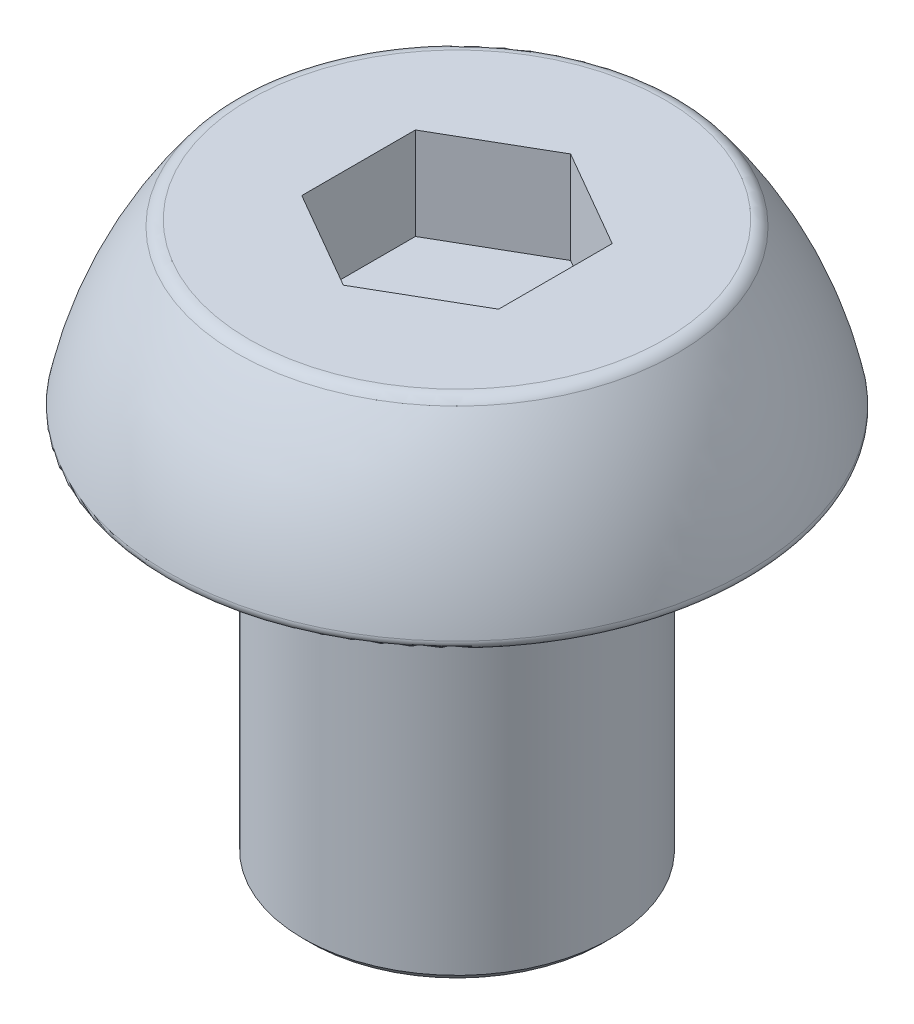
ISO-10303-21;
HEADER;
FILE_DESCRIPTION(('STEP AP214'),'2;1');
FILE_NAME('part.step','',(''),(''),'','','');
FILE_SCHEMA(('AUTOMOTIVE_DESIGN { 1 0 10303 214 1 1 1 1 }'));
ENDSEC;
DATA;
#1=APPLICATION_CONTEXT('core data for automotive mechanical design processes');
#2=APPLICATION_PROTOCOL_DEFINITION('international standard','automotive_design',2000,#1);
#3=PRODUCT_CONTEXT('',#1,'mechanical');
#4=PRODUCT('Part','Part','',(#3));
#5=PRODUCT_RELATED_PRODUCT_CATEGORY('part','',(#4));
#6=PRODUCT_DEFINITION_FORMATION('','',#4);
#7=PRODUCT_DEFINITION_CONTEXT('part definition',#1,'design');
#8=PRODUCT_DEFINITION('design','',#6,#7);
#9=PRODUCT_DEFINITION_SHAPE('','',#8);
#10=(LENGTH_UNIT() NAMED_UNIT(*) SI_UNIT(.MILLI.,.METRE.));
#11=(NAMED_UNIT(*) PLANE_ANGLE_UNIT() SI_UNIT($,.RADIAN.));
#12=(NAMED_UNIT(*) SI_UNIT($,.STERADIAN.) SOLID_ANGLE_UNIT());
#13=UNCERTAINTY_MEASURE_WITH_UNIT(LENGTH_MEASURE(1.E-05),#10,'distance_accuracy_value','');
#14=(GEOMETRIC_REPRESENTATION_CONTEXT(3) GLOBAL_UNCERTAINTY_ASSIGNED_CONTEXT((#13)) GLOBAL_UNIT_ASSIGNED_CONTEXT((#10,
#11,#12)) REPRESENTATION_CONTEXT('',''));
#15=CARTESIAN_POINT('',(0.,0.,0.));
#16=DIRECTION('',(0.,0.,1.));
#17=DIRECTION('',(1.,0.,0.));
#18=AXIS2_PLACEMENT_3D('',#15,#16,#17);
#19=CARTESIAN_POINT('',(0.,0.,0.));
#20=DIRECTION('',(0.,1.,0.));
#21=DIRECTION('',(0.,0.,1.));
#22=AXIS2_PLACEMENT_3D('',#19,#20,#21);
#23=PLANE('',#22);
#24=CARTESIAN_POINT('',(0.,0.,0.));
#25=DIRECTION('',(0.,1.,0.));
#26=DIRECTION('',(0.,0.,1.));
#27=AXIS2_PLACEMENT_3D('',#24,#25,#26);
#28=CIRCLE('',#27,3.67834475098621);
#29=CARTESIAN_POINT('',(0.,0.,3.67834475098621));
#30=VERTEX_POINT('',#29);
#31=EDGE_CURVE('E118',#30,#30,#28,.F.);
#32=ORIENTED_EDGE('',*,*,#31,.T.);
#33=EDGE_LOOP('',(#32));
#34=FACE_BOUND('',#33,.T.);
#35=CARTESIAN_POINT('',(0.,0.,0.));
#36=DIRECTION('',(0.,1.,0.));
#37=DIRECTION('',(0.,0.,1.));
#38=AXIS2_PLACEMENT_3D('',#35,#36,#37);
#39=CIRCLE('',#38,2.);
#40=CARTESIAN_POINT('',(0.,0.,2.));
#41=VERTEX_POINT('',#40);
#42=EDGE_CURVE('E137',#41,#41,#39,.F.);
#43=ORIENTED_EDGE('',*,*,#42,.F.);
#44=EDGE_LOOP('',(#43));
#45=FACE_BOUND('',#44,.T.);
#46=ADVANCED_FACE('F17',(#34,#45),#23,.F.);
#47=CARTESIAN_POINT('',(-2.8,2.2,0.));
#48=DIRECTION('',(0.,-1.,0.));
#49=DIRECTION('',(0.,0.,-1.));
#50=AXIS2_PLACEMENT_3D('',#47,#48,#49);
#51=PLANE('',#50);
#52=DIRECTION('',(-0.866025403784441,0.,0.5));
#53=VECTOR('',#52,1.);
#54=CARTESIAN_POINT('',(0.,2.2,-1.47801668912542));
#55=LINE('',#54,#53);
#56=CARTESIAN_POINT('',(0.,2.2,-1.47801668912542));
#57=VERTEX_POINT('',#56);
#58=CARTESIAN_POINT('',(-1.27999999999998,2.2,-0.739008344562711));
#59=VERTEX_POINT('',#58);
#60=EDGE_CURVE('E106',#57,#59,#55,.T.);
#61=ORIENTED_EDGE('',*,*,#60,.F.);
#62=DIRECTION('',(-0.866025403784441,0.,-0.5));
#63=VECTOR('',#62,1.);
#64=CARTESIAN_POINT('',(1.28,2.2,-0.739008344562722));
#65=LINE('',#64,#63);
#66=CARTESIAN_POINT('',(1.28,2.2,-0.739008344562722));
#67=VERTEX_POINT('',#66);
#68=EDGE_CURVE('E32',#67,#57,#65,.T.);
#69=ORIENTED_EDGE('',*,*,#68,.F.);
#70=DIRECTION('',(0.,0.,-1.));
#71=VECTOR('',#70,1.);
#72=CARTESIAN_POINT('',(1.28,2.2,0.739008344562721));
#73=LINE('',#72,#71);
#74=CARTESIAN_POINT('',(1.28,2.2,0.739008344562721));
#75=VERTEX_POINT('',#74);
#76=EDGE_CURVE('E113',#75,#67,#73,.T.);
#77=ORIENTED_EDGE('',*,*,#76,.F.);
#78=DIRECTION('',(0.866025403784439,0.,-0.5));
#79=VECTOR('',#78,1.);
#80=CARTESIAN_POINT('',(0.,2.2,1.47801668912544));
#81=LINE('',#80,#79);
#82=CARTESIAN_POINT('',(0.,2.2,1.47801668912544));
#83=VERTEX_POINT('',#82);
#84=EDGE_CURVE('E114',#83,#75,#81,.T.);
#85=ORIENTED_EDGE('',*,*,#84,.F.);
#86=DIRECTION('',(0.866025403784439,0.,0.5));
#87=VECTOR('',#86,1.);
#88=CARTESIAN_POINT('',(-1.28,2.2,0.739008344562721));
#89=LINE('',#88,#87);
#90=CARTESIAN_POINT('',(-1.28,2.2,0.739008344562721));
#91=VERTEX_POINT('',#90);
#92=EDGE_CURVE('E79',#91,#83,#89,.T.);
#93=ORIENTED_EDGE('',*,*,#92,.F.);
#94=DIRECTION('',(0.,0.,1.));
#95=VECTOR('',#94,1.);
#96=CARTESIAN_POINT('',(-1.27999999999998,2.2,-0.739008344562711));
#97=LINE('',#96,#95);
#98=EDGE_CURVE('E108',#59,#91,#97,.T.);
#99=ORIENTED_EDGE('',*,*,#98,.F.);
#100=EDGE_LOOP('',(#61,#69,#77,#85,#93,#99));
#101=FACE_BOUND('',#100,.T.);
#102=CARTESIAN_POINT('',(0.,2.2,0.));
#103=DIRECTION('',(0.,-1.,0.));
#104=DIRECTION('',(0.,0.,-1.));
#105=AXIS2_PLACEMENT_3D('',#102,#103,#104);
#106=CIRCLE('',#105,2.70215560417085);
#107=CARTESIAN_POINT('',(0.,2.2,-2.70215560417085));
#108=VERTEX_POINT('',#107);
#109=EDGE_CURVE('E132',#108,#108,#106,.F.);
#110=ORIENTED_EDGE('',*,*,#109,.T.);
#111=EDGE_LOOP('',(#110));
#112=FACE_BOUND('',#111,.T.);
#113=ADVANCED_FACE('F152',(#101,#112),#51,.F.);
#114=CARTESIAN_POINT('',(0.,-0.90769069276326,0.));
#115=DIRECTION('',(0.,-1.,0.));
#116=DIRECTION('',(0.,0.,-1.));
#117=AXIS2_PLACEMENT_3D('',#114,#115,#116);
#118=DEGENERATE_TOROIDAL_SURFACE('',#117,1.11691952407917,5.,.F.);
#119=CARTESIAN_POINT('',(0.,2.12115377886514,0.));
#120=DIRECTION('',(0.,-1.,0.));
#121=DIRECTION('',(0.,0.,-1.));
#122=AXIS2_PLACEMENT_3D('',#119,#120,#121);
#123=CIRCLE('',#122,2.8612837345146);
#124=CARTESIAN_POINT('',(0.,2.12115377886514,-2.8612837345146));
#125=VERTEX_POINT('',#124);
#126=EDGE_CURVE('E129',#125,#125,#123,.T.);
#127=ORIENTED_EDGE('',*,*,#126,.T.);
#128=EDGE_LOOP('',(#127));
#129=FACE_BOUND('',#128,.T.);
#130=CARTESIAN_POINT('',(0.,0.120565116178842,0.));
#131=DIRECTION('',(0.,-1.,0.));
#132=DIRECTION('',(0.,0.,-1.));
#133=AXIS2_PLACEMENT_3D('',#130,#131,#132);
#134=CIRCLE('',#133,3.77620728721203);
#135=CARTESIAN_POINT('',(0.,0.120565116178842,-3.77620728721203));
#136=VERTEX_POINT('',#135);
#137=EDGE_CURVE('E126',#136,#136,#134,.F.);
#138=ORIENTED_EDGE('',*,*,#137,.T.);
#139=EDGE_LOOP('',(#138));
#140=FACE_BOUND('',#139,.T.);
#141=ADVANCED_FACE('F161',(#129,#140),#118,.F.);
#142=CARTESIAN_POINT('',(0.,0.1,0.));
#143=DIRECTION('',(0.,1.,0.));
#144=DIRECTION('',(0.,0.,1.));
#145=AXIS2_PLACEMENT_3D('',#142,#143,#144);
#146=TOROIDAL_SURFACE('',#145,3.67834475098621,0.1);
#147=ORIENTED_EDGE('',*,*,#137,.F.);
#148=EDGE_LOOP('',(#147));
#149=FACE_BOUND('',#148,.T.);
#150=ORIENTED_EDGE('',*,*,#31,.F.);
#151=EDGE_LOOP('',(#150));
#152=FACE_BOUND('',#151,.T.);
#153=ADVANCED_FACE('F168',(#149,#152),#146,.T.);
#154=CARTESIAN_POINT('',(0.,2.,0.));
#155=DIRECTION('',(0.,-1.,0.));
#156=DIRECTION('',(0.,0.,-1.));
#157=AXIS2_PLACEMENT_3D('',#154,#155,#156);
#158=TOROIDAL_SURFACE('',#157,2.70215560417085,0.2);
#159=ORIENTED_EDGE('',*,*,#109,.F.);
#160=EDGE_LOOP('',(#159));
#161=FACE_BOUND('',#160,.T.);
#162=ORIENTED_EDGE('',*,*,#126,.F.);
#163=EDGE_LOOP('',(#162));
#164=FACE_BOUND('',#163,.T.);
#165=ADVANCED_FACE('F173',(#161,#164),#158,.T.);
#166=CARTESIAN_POINT('',(1.28,1.,-0.739008344562722));
#167=DIRECTION('',(0.5,0.,-0.866025403784441));
#168=DIRECTION('',(-0.866025403784441,0.,-0.5));
#169=AXIS2_PLACEMENT_3D('',#166,#167,#168);
#170=PLANE('',#169);
#171=ORIENTED_EDGE('',*,*,#68,.T.);
#172=DIRECTION('',(0.,1.,0.));
#173=VECTOR('',#172,1.);
#174=CARTESIAN_POINT('',(0.,1.,-1.47801668912542));
#175=LINE('',#174,#173);
#176=CARTESIAN_POINT('',(0.,1.,-1.47801668912542));
#177=VERTEX_POINT('',#176);
#178=EDGE_CURVE('E62',#177,#57,#175,.T.);
#179=ORIENTED_EDGE('',*,*,#178,.F.);
#180=DIRECTION('',(-0.866025403784441,0.,-0.5));
#181=VECTOR('',#180,1.);
#182=CARTESIAN_POINT('',(1.28,1.,-0.739008344562722));
#183=LINE('',#182,#181);
#184=CARTESIAN_POINT('',(1.28,1.,-0.739008344562722));
#185=VERTEX_POINT('',#184);
#186=EDGE_CURVE('E117',#185,#177,#183,.T.);
#187=ORIENTED_EDGE('',*,*,#186,.F.);
#188=DIRECTION('',(0.,1.,0.));
#189=VECTOR('',#188,1.);
#190=CARTESIAN_POINT('',(1.28,1.,-0.739008344562722));
#191=LINE('',#190,#189);
#192=EDGE_CURVE('E37',#185,#67,#191,.T.);
#193=ORIENTED_EDGE('',*,*,#192,.T.);
#194=EDGE_LOOP('',(#171,#179,#187,#193));
#195=FACE_BOUND('',#194,.T.);
#196=ADVANCED_FACE('F170',(#195),#170,.F.);
#197=CARTESIAN_POINT('',(1.28,1.,0.739008344562721));
#198=DIRECTION('',(1.,0.,0.));
#199=DIRECTION('',(0.,0.,-1.));
#200=AXIS2_PLACEMENT_3D('',#197,#198,#199);
#201=PLANE('',#200);
#202=ORIENTED_EDGE('',*,*,#76,.T.);
#203=ORIENTED_EDGE('',*,*,#192,.F.);
#204=DIRECTION('',(0.,0.,-1.));
#205=VECTOR('',#204,1.);
#206=CARTESIAN_POINT('',(1.28,1.,0.739008344562721));
#207=LINE('',#206,#205);
#208=CARTESIAN_POINT('',(1.28,1.,0.739008344562721));
#209=VERTEX_POINT('',#208);
#210=EDGE_CURVE('E95',#209,#185,#207,.T.);
#211=ORIENTED_EDGE('',*,*,#210,.F.);
#212=DIRECTION('',(0.,1.,0.));
#213=VECTOR('',#212,1.);
#214=CARTESIAN_POINT('',(1.28,1.,0.739008344562721));
#215=LINE('',#214,#213);
#216=EDGE_CURVE('E81',#209,#75,#215,.T.);
#217=ORIENTED_EDGE('',*,*,#216,.T.);
#218=EDGE_LOOP('',(#202,#203,#211,#217));
#219=FACE_BOUND('',#218,.T.);
#220=ADVANCED_FACE('F181',(#219),#201,.F.);
#221=CARTESIAN_POINT('',(0.,1.,1.47801668912544));
#222=DIRECTION('',(0.5,0.,0.866025403784439));
#223=DIRECTION('',(0.866025403784439,0.,-0.5));
#224=AXIS2_PLACEMENT_3D('',#221,#222,#223);
#225=PLANE('',#224);
#226=ORIENTED_EDGE('',*,*,#84,.T.);
#227=ORIENTED_EDGE('',*,*,#216,.F.);
#228=DIRECTION('',(0.866025403784439,0.,-0.5));
#229=VECTOR('',#228,1.);
#230=CARTESIAN_POINT('',(0.,1.,1.47801668912544));
#231=LINE('',#230,#229);
#232=CARTESIAN_POINT('',(0.,1.,1.47801668912544));
#233=VERTEX_POINT('',#232);
#234=EDGE_CURVE('E86',#233,#209,#231,.T.);
#235=ORIENTED_EDGE('',*,*,#234,.F.);
#236=DIRECTION('',(0.,1.,0.));
#237=VECTOR('',#236,1.);
#238=CARTESIAN_POINT('',(0.,1.,1.47801668912544));
#239=LINE('',#238,#237);
#240=EDGE_CURVE('E73',#233,#83,#239,.T.);
#241=ORIENTED_EDGE('',*,*,#240,.T.);
#242=EDGE_LOOP('',(#226,#227,#235,#241));
#243=FACE_BOUND('',#242,.T.);
#244=ADVANCED_FACE('F90',(#243),#225,.F.);
#245=CARTESIAN_POINT('',(-1.28,1.,0.739008344562721));
#246=DIRECTION('',(-0.5,0.,0.866025403784439));
#247=DIRECTION('',(0.866025403784439,0.,0.5));
#248=AXIS2_PLACEMENT_3D('',#245,#246,#247);
#249=PLANE('',#248);
#250=ORIENTED_EDGE('',*,*,#92,.T.);
#251=ORIENTED_EDGE('',*,*,#240,.F.);
#252=DIRECTION('',(0.866025403784439,0.,0.5));
#253=VECTOR('',#252,1.);
#254=CARTESIAN_POINT('',(-1.28,1.,0.739008344562721));
#255=LINE('',#254,#253);
#256=CARTESIAN_POINT('',(-1.28,1.,0.739008344562721));
#257=VERTEX_POINT('',#256);
#258=EDGE_CURVE('E80',#257,#233,#255,.T.);
#259=ORIENTED_EDGE('',*,*,#258,.F.);
#260=DIRECTION('',(0.,1.,0.));
#261=VECTOR('',#260,1.);
#262=CARTESIAN_POINT('',(-1.28,1.,0.739008344562721));
#263=LINE('',#262,#261);
#264=EDGE_CURVE('E83',#257,#91,#263,.T.);
#265=ORIENTED_EDGE('',*,*,#264,.T.);
#266=EDGE_LOOP('',(#250,#251,#259,#265));
#267=FACE_BOUND('',#266,.T.);
#268=ADVANCED_FACE('F74',(#267),#249,.F.);
#269=CARTESIAN_POINT('',(-1.27999999999998,1.,-0.739008344562711));
#270=DIRECTION('',(-1.,0.,0.));
#271=DIRECTION('',(0.,0.,1.));
#272=AXIS2_PLACEMENT_3D('',#269,#270,#271);
#273=PLANE('',#272);
#274=ORIENTED_EDGE('',*,*,#98,.T.);
#275=ORIENTED_EDGE('',*,*,#264,.F.);
#276=DIRECTION('',(0.,0.,1.));
#277=VECTOR('',#276,1.);
#278=CARTESIAN_POINT('',(-1.27999999999998,1.,-0.739008344562711));
#279=LINE('',#278,#277);
#280=CARTESIAN_POINT('',(-1.27999999999998,1.,-0.739008344562711));
#281=VERTEX_POINT('',#280);
#282=EDGE_CURVE('E98',#281,#257,#279,.T.);
#283=ORIENTED_EDGE('',*,*,#282,.F.);
#284=DIRECTION('',(0.,1.,0.));
#285=VECTOR('',#284,1.);
#286=CARTESIAN_POINT('',(-1.27999999999998,1.,-0.739008344562711));
#287=LINE('',#286,#285);
#288=EDGE_CURVE('E121',#281,#59,#287,.T.);
#289=ORIENTED_EDGE('',*,*,#288,.T.);
#290=EDGE_LOOP('',(#274,#275,#283,#289));
#291=FACE_BOUND('',#290,.T.);
#292=ADVANCED_FACE('F206',(#291),#273,.F.);
#293=CARTESIAN_POINT('',(0.,1.,-1.47801668912542));
#294=DIRECTION('',(-0.5,0.,-0.866025403784441));
#295=DIRECTION('',(-0.866025403784441,0.,0.5));
#296=AXIS2_PLACEMENT_3D('',#293,#294,#295);
#297=PLANE('',#296);
#298=ORIENTED_EDGE('',*,*,#60,.T.);
#299=ORIENTED_EDGE('',*,*,#288,.F.);
#300=DIRECTION('',(-0.866025403784441,0.,0.5));
#301=VECTOR('',#300,1.);
#302=CARTESIAN_POINT('',(0.,1.,-1.47801668912542));
#303=LINE('',#302,#301);
#304=EDGE_CURVE('E99',#177,#281,#303,.T.);
#305=ORIENTED_EDGE('',*,*,#304,.F.);
#306=ORIENTED_EDGE('',*,*,#178,.T.);
#307=EDGE_LOOP('',(#298,#299,#305,#306));
#308=FACE_BOUND('',#307,.T.);
#309=ADVANCED_FACE('F208',(#308),#297,.F.);
#310=CARTESIAN_POINT('',(0.,1.,0.));
#311=DIRECTION('',(0.,1.,0.));
#312=DIRECTION('',(0.,0.,1.));
#313=AXIS2_PLACEMENT_3D('',#310,#311,#312);
#314=PLANE('',#313);
#315=ORIENTED_EDGE('',*,*,#186,.T.);
#316=ORIENTED_EDGE('',*,*,#304,.T.);
#317=ORIENTED_EDGE('',*,*,#282,.T.);
#318=ORIENTED_EDGE('',*,*,#258,.T.);
#319=ORIENTED_EDGE('',*,*,#234,.T.);
#320=ORIENTED_EDGE('',*,*,#210,.T.);
#321=EDGE_LOOP('',(#315,#316,#317,#318,#319,#320));
#322=FACE_BOUND('',#321,.T.);
#323=ADVANCED_FACE('F92',(#322),#314,.T.);
#324=CARTESIAN_POINT('',(0.,-5.,0.));
#325=DIRECTION('',(0.,1.,0.));
#326=DIRECTION('',(0.,0.,1.));
#327=AXIS2_PLACEMENT_3D('',#324,#325,#326);
#328=CYLINDRICAL_SURFACE('',#327,2.);
#329=CARTESIAN_POINT('',(0.,-4.9,0.));
#330=DIRECTION('',(0.,-1.,0.));
#331=DIRECTION('',(0.,0.,-1.));
#332=AXIS2_PLACEMENT_3D('',#329,#330,#331);
#333=CIRCLE('',#332,2.);
#334=CARTESIAN_POINT('',(0.,-4.9,-2.));
#335=VERTEX_POINT('',#334);
#336=EDGE_CURVE('E11',#335,#335,#333,.F.);
#337=ORIENTED_EDGE('',*,*,#336,.T.);
#338=EDGE_LOOP('',(#337));
#339=FACE_BOUND('',#338,.T.);
#340=ORIENTED_EDGE('',*,*,#42,.T.);
#341=EDGE_LOOP('',(#340));
#342=FACE_BOUND('',#341,.T.);
#343=ADVANCED_FACE('F147',(#339,#342),#328,.T.);
#344=CARTESIAN_POINT('',(0.,-5.,0.));
#345=DIRECTION('',(0.,-1.,0.));
#346=DIRECTION('',(0.,0.,-1.));
#347=AXIS2_PLACEMENT_3D('',#344,#345,#346);
#348=PLANE('',#347);
#349=CARTESIAN_POINT('',(0.,-5.,0.));
#350=DIRECTION('',(0.,-1.,0.));
#351=DIRECTION('',(0.,0.,-1.));
#352=AXIS2_PLACEMENT_3D('',#349,#350,#351);
#353=CIRCLE('',#352,1.9);
#354=CARTESIAN_POINT('',(0.,-5.,-1.9));
#355=VERTEX_POINT('',#354);
#356=EDGE_CURVE('E25',#355,#355,#353,.T.);
#357=ORIENTED_EDGE('',*,*,#356,.T.);
#358=EDGE_LOOP('',(#357));
#359=FACE_BOUND('',#358,.T.);
#360=ADVANCED_FACE('F143',(#359),#348,.T.);
#361=CARTESIAN_POINT('',(0.,-5.,0.));
#362=DIRECTION('',(0.,1.,0.));
#363=DIRECTION('',(0.,0.,1.));
#364=AXIS2_PLACEMENT_3D('',#361,#362,#363);
#365=CONICAL_SURFACE('',#364,1.9,0.785398163397457);
#366=ORIENTED_EDGE('',*,*,#336,.F.);
#367=EDGE_LOOP('',(#366));
#368=FACE_BOUND('',#367,.T.);
#369=ORIENTED_EDGE('',*,*,#356,.F.);
#370=EDGE_LOOP('',(#369));
#371=FACE_BOUND('',#370,.T.);
#372=ADVANCED_FACE('F19',(#368,#371),#365,.T.);
#373=CLOSED_SHELL('',(#46,#113,#141,#153,#165,#196,#220,#244,#268,#292,#309,#323,#343,#360,#372));
#374=MANIFOLD_SOLID_BREP('B1',#373);
#375=ADVANCED_BREP_SHAPE_REPRESENTATION('',(#18,#374),#14);
#376=SHAPE_DEFINITION_REPRESENTATION(#9,#375);
ENDSEC;
END-ISO-10303-21;
